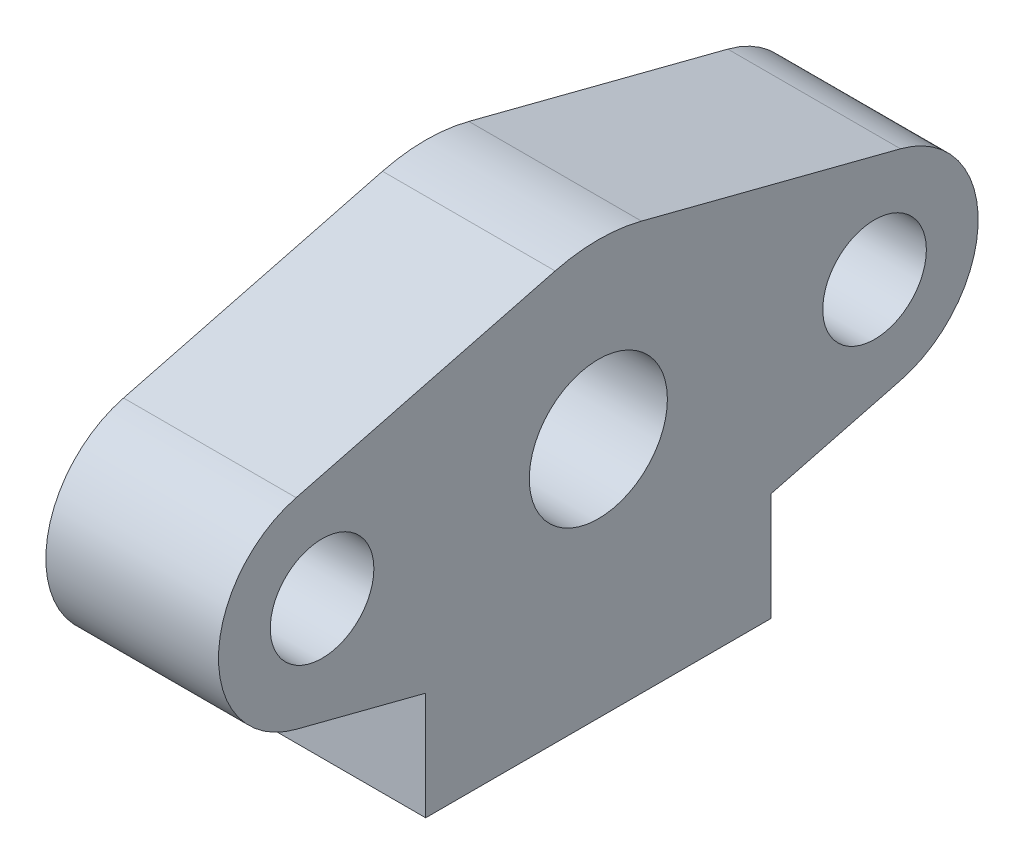
ISO-10303-21;
HEADER;
FILE_DESCRIPTION(('STEP AP214'),'2;1');
FILE_NAME('part.step','',(''),(''),'','','');
FILE_SCHEMA(('AUTOMOTIVE_DESIGN { 1 0 10303 214 1 1 1 1 }'));
ENDSEC;
DATA;
#1=APPLICATION_CONTEXT('core data for automotive mechanical design processes');
#2=APPLICATION_PROTOCOL_DEFINITION('international standard','automotive_design',2000,#1);
#3=PRODUCT_CONTEXT('',#1,'mechanical');
#4=PRODUCT('Part','Part','',(#3));
#5=PRODUCT_RELATED_PRODUCT_CATEGORY('part','',(#4));
#6=PRODUCT_DEFINITION_FORMATION('','',#4);
#7=PRODUCT_DEFINITION_CONTEXT('part definition',#1,'design');
#8=PRODUCT_DEFINITION('design','',#6,#7);
#9=PRODUCT_DEFINITION_SHAPE('','',#8);
#10=(LENGTH_UNIT() NAMED_UNIT(*) SI_UNIT(.MILLI.,.METRE.));
#11=(NAMED_UNIT(*) PLANE_ANGLE_UNIT() SI_UNIT($,.RADIAN.));
#12=(NAMED_UNIT(*) SI_UNIT($,.STERADIAN.) SOLID_ANGLE_UNIT());
#13=UNCERTAINTY_MEASURE_WITH_UNIT(LENGTH_MEASURE(1.E-05),#10,'distance_accuracy_value','');
#14=(GEOMETRIC_REPRESENTATION_CONTEXT(3) GLOBAL_UNCERTAINTY_ASSIGNED_CONTEXT((#13)) GLOBAL_UNIT_ASSIGNED_CONTEXT((#10,
#11,#12)) REPRESENTATION_CONTEXT('',''));
#15=CARTESIAN_POINT('',(0.,0.,0.));
#16=DIRECTION('',(0.,0.,1.));
#17=DIRECTION('',(1.,0.,0.));
#18=AXIS2_PLACEMENT_3D('',#15,#16,#17);
#19=CARTESIAN_POINT('',(10.,0.,0.));
#20=DIRECTION('',(1.,0.,0.));
#21=DIRECTION('',(0.,0.,-1.));
#22=AXIS2_PLACEMENT_3D('',#19,#20,#21);
#23=PLANE('',#22);
#24=CARTESIAN_POINT('',(10.,0.,-16.));
#25=DIRECTION('',(1.,0.,0.));
#26=DIRECTION('',(0.,0.,-1.));
#27=AXIS2_PLACEMENT_3D('',#24,#25,#26);
#28=CIRCLE('',#27,3.);
#29=CARTESIAN_POINT('',(10.,0.,-19.));
#30=VERTEX_POINT('',#29);
#31=EDGE_CURVE('E211',#30,#30,#28,.T.);
#32=ORIENTED_EDGE('',*,*,#31,.F.);
#33=EDGE_LOOP('',(#32));
#34=FACE_BOUND('',#33,.T.);
#35=CARTESIAN_POINT('',(10.,0.,0.));
#36=DIRECTION('',(1.,0.,0.));
#37=DIRECTION('',(0.,0.,-1.));
#38=AXIS2_PLACEMENT_3D('',#35,#36,#37);
#39=CIRCLE('',#38,10.);
#40=CARTESIAN_POINT('',(10.,9.68245836551855,-2.5));
#41=VERTEX_POINT('',#40);
#42=CARTESIAN_POINT('',(10.,9.68245836551855,2.5));
#43=VERTEX_POINT('',#42);
#44=EDGE_CURVE('E160',#41,#43,#39,.T.);
#45=ORIENTED_EDGE('',*,*,#44,.T.);
#46=DIRECTION('',(0.,-0.25,0.968245836551854));
#47=VECTOR('',#46,1.);
#48=CARTESIAN_POINT('',(10.,5.80947501931113,17.5));
#49=LINE('',#48,#47);
#50=CARTESIAN_POINT('',(10.,5.80947501931113,17.5));
#51=VERTEX_POINT('',#50);
#52=EDGE_CURVE('E98',#43,#51,#49,.T.);
#53=ORIENTED_EDGE('',*,*,#52,.T.);
#54=CARTESIAN_POINT('',(10.,0.,16.));
#55=DIRECTION('',(1.,0.,0.));
#56=DIRECTION('',(0.,0.,-1.));
#57=AXIS2_PLACEMENT_3D('',#54,#55,#56);
#58=CIRCLE('',#57,6.);
#59=CARTESIAN_POINT('',(10.,-5.80947501931113,17.5));
#60=VERTEX_POINT('',#59);
#61=EDGE_CURVE('E181',#51,#60,#58,.T.);
#62=ORIENTED_EDGE('',*,*,#61,.T.);
#63=DIRECTION('',(0.,-0.25,-0.968245836551854));
#64=VECTOR('',#63,1.);
#65=CARTESIAN_POINT('',(10.,-5.80947501931113,17.5));
#66=LINE('',#65,#64);
#67=CARTESIAN_POINT('',(10.,-7.74596669241484,10.));
#68=VERTEX_POINT('',#67);
#69=EDGE_CURVE('E200',#60,#68,#66,.T.);
#70=ORIENTED_EDGE('',*,*,#69,.T.);
#71=DIRECTION('',(0.,-1.,0.));
#72=VECTOR('',#71,1.);
#73=CARTESIAN_POINT('',(10.,-7.74596669241484,10.));
#74=LINE('',#73,#72);
#75=CARTESIAN_POINT('',(10.,-14.,10.));
#76=VERTEX_POINT('',#75);
#77=EDGE_CURVE('E197',#68,#76,#74,.T.);
#78=ORIENTED_EDGE('',*,*,#77,.T.);
#79=DIRECTION('',(0.,0.,-1.));
#80=VECTOR('',#79,1.);
#81=CARTESIAN_POINT('',(10.,-14.,10.));
#82=LINE('',#81,#80);
#83=CARTESIAN_POINT('',(10.,-14.,-10.));
#84=VERTEX_POINT('',#83);
#85=EDGE_CURVE('E199',#76,#84,#82,.T.);
#86=ORIENTED_EDGE('',*,*,#85,.T.);
#87=DIRECTION('',(0.,1.,0.));
#88=VECTOR('',#87,1.);
#89=CARTESIAN_POINT('',(10.,-7.74596669241484,-10.));
#90=LINE('',#89,#88);
#91=CARTESIAN_POINT('',(10.,-7.74596669241484,-10.));
#92=VERTEX_POINT('',#91);
#93=EDGE_CURVE('E123',#84,#92,#90,.T.);
#94=ORIENTED_EDGE('',*,*,#93,.T.);
#95=DIRECTION('',(0.,0.25,-0.968245836551854));
#96=VECTOR('',#95,1.);
#97=CARTESIAN_POINT('',(10.,-5.80947501931113,-17.5));
#98=LINE('',#97,#96);
#99=CARTESIAN_POINT('',(10.,-5.80947501931113,-17.5));
#100=VERTEX_POINT('',#99);
#101=EDGE_CURVE('E117',#92,#100,#98,.T.);
#102=ORIENTED_EDGE('',*,*,#101,.T.);
#103=CARTESIAN_POINT('',(10.,0.,-16.));
#104=DIRECTION('',(1.,0.,0.));
#105=DIRECTION('',(0.,0.,1.));
#106=AXIS2_PLACEMENT_3D('',#103,#104,#105);
#107=CIRCLE('',#106,6.);
#108=CARTESIAN_POINT('',(10.,5.80947501931113,-17.5));
#109=VERTEX_POINT('',#108);
#110=EDGE_CURVE('E121',#100,#109,#107,.T.);
#111=ORIENTED_EDGE('',*,*,#110,.T.);
#112=DIRECTION('',(0.,0.25,0.968245836551854));
#113=VECTOR('',#112,1.);
#114=CARTESIAN_POINT('',(10.,5.80947501931113,-17.5));
#115=LINE('',#114,#113);
#116=EDGE_CURVE('E49',#109,#41,#115,.T.);
#117=ORIENTED_EDGE('',*,*,#116,.T.);
#118=EDGE_LOOP('',(#45,#53,#62,#70,#78,#86,#94,#102,#111,#117));
#119=FACE_BOUND('',#118,.T.);
#120=CARTESIAN_POINT('',(10.,0.,0.));
#121=DIRECTION('',(1.,0.,0.));
#122=DIRECTION('',(0.,0.,-1.));
#123=AXIS2_PLACEMENT_3D('',#120,#121,#122);
#124=CIRCLE('',#123,4.);
#125=CARTESIAN_POINT('',(10.,0.,-4.));
#126=VERTEX_POINT('',#125);
#127=EDGE_CURVE('E145',#126,#126,#124,.T.);
#128=ORIENTED_EDGE('',*,*,#127,.F.);
#129=EDGE_LOOP('',(#128));
#130=FACE_BOUND('',#129,.T.);
#131=CARTESIAN_POINT('',(10.,0.,16.));
#132=DIRECTION('',(1.,0.,0.));
#133=DIRECTION('',(0.,0.,-1.));
#134=AXIS2_PLACEMENT_3D('',#131,#132,#133);
#135=CIRCLE('',#134,3.);
#136=CARTESIAN_POINT('',(10.,0.,13.));
#137=VERTEX_POINT('',#136);
#138=EDGE_CURVE('E217',#137,#137,#135,.T.);
#139=ORIENTED_EDGE('',*,*,#138,.F.);
#140=EDGE_LOOP('',(#139));
#141=FACE_BOUND('',#140,.T.);
#142=ADVANCED_FACE('F32',(#34,#119,#130,#141),#23,.T.);
#143=CARTESIAN_POINT('',(0.,0.,0.));
#144=DIRECTION('',(1.,0.,0.));
#145=DIRECTION('',(0.,0.,-1.));
#146=AXIS2_PLACEMENT_3D('',#143,#144,#145);
#147=PLANE('',#146);
#148=CARTESIAN_POINT('',(0.,0.,0.));
#149=DIRECTION('',(1.,0.,0.));
#150=DIRECTION('',(0.,0.,-1.));
#151=AXIS2_PLACEMENT_3D('',#148,#149,#150);
#152=CIRCLE('',#151,10.);
#153=CARTESIAN_POINT('',(0.,9.68245836551855,-2.5));
#154=VERTEX_POINT('',#153);
#155=CARTESIAN_POINT('',(0.,9.68245836551855,2.5));
#156=VERTEX_POINT('',#155);
#157=EDGE_CURVE('E141',#154,#156,#152,.T.);
#158=ORIENTED_EDGE('',*,*,#157,.F.);
#159=DIRECTION('',(0.,0.25,0.968245836551854));
#160=VECTOR('',#159,1.);
#161=CARTESIAN_POINT('',(0.,5.80947501931113,-17.5));
#162=LINE('',#161,#160);
#163=CARTESIAN_POINT('',(0.,5.80947501931113,-17.5));
#164=VERTEX_POINT('',#163);
#165=EDGE_CURVE('E90',#164,#154,#162,.T.);
#166=ORIENTED_EDGE('',*,*,#165,.F.);
#167=CARTESIAN_POINT('',(0.,0.,-16.));
#168=DIRECTION('',(1.,0.,0.));
#169=DIRECTION('',(0.,0.,1.));
#170=AXIS2_PLACEMENT_3D('',#167,#168,#169);
#171=CIRCLE('',#170,6.);
#172=CARTESIAN_POINT('',(0.,-5.80947501931113,-17.5));
#173=VERTEX_POINT('',#172);
#174=EDGE_CURVE('E84',#173,#164,#171,.T.);
#175=ORIENTED_EDGE('',*,*,#174,.F.);
#176=DIRECTION('',(0.,0.25,-0.968245836551854));
#177=VECTOR('',#176,1.);
#178=CARTESIAN_POINT('',(0.,-5.80947501931113,-17.5));
#179=LINE('',#178,#177);
#180=CARTESIAN_POINT('',(0.,-7.74596669241484,-10.));
#181=VERTEX_POINT('',#180);
#182=EDGE_CURVE('E131',#181,#173,#179,.T.);
#183=ORIENTED_EDGE('',*,*,#182,.F.);
#184=DIRECTION('',(0.,1.,0.));
#185=VECTOR('',#184,1.);
#186=CARTESIAN_POINT('',(0.,-7.74596669241484,-10.));
#187=LINE('',#186,#185);
#188=CARTESIAN_POINT('',(0.,-14.,-10.));
#189=VERTEX_POINT('',#188);
#190=EDGE_CURVE('E155',#189,#181,#187,.T.);
#191=ORIENTED_EDGE('',*,*,#190,.F.);
#192=DIRECTION('',(0.,0.,-1.));
#193=VECTOR('',#192,1.);
#194=CARTESIAN_POINT('',(0.,-14.,10.));
#195=LINE('',#194,#193);
#196=CARTESIAN_POINT('',(0.,-14.,10.));
#197=VERTEX_POINT('',#196);
#198=EDGE_CURVE('E153',#197,#189,#195,.T.);
#199=ORIENTED_EDGE('',*,*,#198,.F.);
#200=DIRECTION('',(0.,-1.,0.));
#201=VECTOR('',#200,1.);
#202=CARTESIAN_POINT('',(0.,-7.74596669241484,10.));
#203=LINE('',#202,#201);
#204=CARTESIAN_POINT('',(0.,-7.74596669241484,10.));
#205=VERTEX_POINT('',#204);
#206=EDGE_CURVE('E151',#205,#197,#203,.T.);
#207=ORIENTED_EDGE('',*,*,#206,.F.);
#208=DIRECTION('',(0.,-0.25,-0.968245836551854));
#209=VECTOR('',#208,1.);
#210=CARTESIAN_POINT('',(0.,-5.80947501931113,17.5));
#211=LINE('',#210,#209);
#212=CARTESIAN_POINT('',(0.,-5.80947501931113,17.5));
#213=VERTEX_POINT('',#212);
#214=EDGE_CURVE('E149',#213,#205,#211,.T.);
#215=ORIENTED_EDGE('',*,*,#214,.F.);
#216=CARTESIAN_POINT('',(0.,0.,16.));
#217=DIRECTION('',(1.,0.,0.));
#218=DIRECTION('',(0.,0.,-1.));
#219=AXIS2_PLACEMENT_3D('',#216,#217,#218);
#220=CIRCLE('',#219,6.);
#221=CARTESIAN_POINT('',(0.,5.80947501931113,17.5));
#222=VERTEX_POINT('',#221);
#223=EDGE_CURVE('E147',#222,#213,#220,.T.);
#224=ORIENTED_EDGE('',*,*,#223,.F.);
#225=DIRECTION('',(0.,-0.25,0.968245836551854));
#226=VECTOR('',#225,1.);
#227=CARTESIAN_POINT('',(0.,5.80947501931113,17.5));
#228=LINE('',#227,#226);
#229=EDGE_CURVE('E144',#156,#222,#228,.T.);
#230=ORIENTED_EDGE('',*,*,#229,.F.);
#231=EDGE_LOOP('',(#158,#166,#175,#183,#191,#199,#207,#215,#224,#230));
#232=FACE_BOUND('',#231,.T.);
#233=CARTESIAN_POINT('',(0.,0.,0.));
#234=DIRECTION('',(1.,0.,0.));
#235=DIRECTION('',(0.,0.,-1.));
#236=AXIS2_PLACEMENT_3D('',#233,#234,#235);
#237=CIRCLE('',#236,4.);
#238=CARTESIAN_POINT('',(0.,0.,-4.));
#239=VERTEX_POINT('',#238);
#240=EDGE_CURVE('E208',#239,#239,#237,.T.);
#241=ORIENTED_EDGE('',*,*,#240,.T.);
#242=EDGE_LOOP('',(#241));
#243=FACE_BOUND('',#242,.T.);
#244=CARTESIAN_POINT('',(0.,0.,-16.));
#245=DIRECTION('',(1.,0.,0.));
#246=DIRECTION('',(0.,0.,-1.));
#247=AXIS2_PLACEMENT_3D('',#244,#245,#246);
#248=CIRCLE('',#247,3.);
#249=CARTESIAN_POINT('',(0.,0.,-19.));
#250=VERTEX_POINT('',#249);
#251=EDGE_CURVE('E214',#250,#250,#248,.T.);
#252=ORIENTED_EDGE('',*,*,#251,.T.);
#253=EDGE_LOOP('',(#252));
#254=FACE_BOUND('',#253,.T.);
#255=CARTESIAN_POINT('',(0.,0.,16.));
#256=DIRECTION('',(1.,0.,0.));
#257=DIRECTION('',(0.,0.,-1.));
#258=AXIS2_PLACEMENT_3D('',#255,#256,#257);
#259=CIRCLE('',#258,3.);
#260=CARTESIAN_POINT('',(0.,0.,13.));
#261=VERTEX_POINT('',#260);
#262=EDGE_CURVE('E220',#261,#261,#259,.T.);
#263=ORIENTED_EDGE('',*,*,#262,.T.);
#264=EDGE_LOOP('',(#263));
#265=FACE_BOUND('',#264,.T.);
#266=ADVANCED_FACE('F185',(#232,#243,#254,#265),#147,.F.);
#267=CARTESIAN_POINT('',(10.,0.,0.));
#268=DIRECTION('',(-1.,0.,0.));
#269=DIRECTION('',(0.,0.,1.));
#270=AXIS2_PLACEMENT_3D('',#267,#268,#269);
#271=CYLINDRICAL_SURFACE('',#270,10.);
#272=ORIENTED_EDGE('',*,*,#157,.T.);
#273=DIRECTION('',(-1.,0.,0.));
#274=VECTOR('',#273,1.);
#275=CARTESIAN_POINT('',(10.,9.68245836551855,2.5));
#276=LINE('',#275,#274);
#277=EDGE_CURVE('E11',#43,#156,#276,.T.);
#278=ORIENTED_EDGE('',*,*,#277,.F.);
#279=ORIENTED_EDGE('',*,*,#44,.F.);
#280=DIRECTION('',(-1.,0.,0.));
#281=VECTOR('',#280,1.);
#282=CARTESIAN_POINT('',(10.,9.68245836551855,-2.5));
#283=LINE('',#282,#281);
#284=EDGE_CURVE('E137',#41,#154,#283,.T.);
#285=ORIENTED_EDGE('',*,*,#284,.T.);
#286=EDGE_LOOP('',(#272,#278,#279,#285));
#287=FACE_BOUND('',#286,.T.);
#288=ADVANCED_FACE('F34',(#287),#271,.T.);
#289=CARTESIAN_POINT('',(10.,5.80947501931113,17.5));
#290=DIRECTION('',(0.,-0.968245836551854,-0.25));
#291=DIRECTION('',(0.,0.25,-0.968245836551854));
#292=AXIS2_PLACEMENT_3D('',#289,#290,#291);
#293=PLANE('',#292);
#294=ORIENTED_EDGE('',*,*,#229,.T.);
#295=DIRECTION('',(-1.,0.,0.));
#296=VECTOR('',#295,1.);
#297=CARTESIAN_POINT('',(10.,5.80947501931113,17.5));
#298=LINE('',#297,#296);
#299=EDGE_CURVE('E41',#51,#222,#298,.T.);
#300=ORIENTED_EDGE('',*,*,#299,.F.);
#301=ORIENTED_EDGE('',*,*,#52,.F.);
#302=ORIENTED_EDGE('',*,*,#277,.T.);
#303=EDGE_LOOP('',(#294,#300,#301,#302));
#304=FACE_BOUND('',#303,.T.);
#305=ADVANCED_FACE('F261',(#304),#293,.F.);
#306=CARTESIAN_POINT('',(10.,0.,16.));
#307=DIRECTION('',(-1.,0.,0.));
#308=DIRECTION('',(0.,0.,1.));
#309=AXIS2_PLACEMENT_3D('',#306,#307,#308);
#310=CYLINDRICAL_SURFACE('',#309,6.);
#311=ORIENTED_EDGE('',*,*,#223,.T.);
#312=DIRECTION('',(-1.,0.,0.));
#313=VECTOR('',#312,1.);
#314=CARTESIAN_POINT('',(10.,-5.80947501931113,17.5));
#315=LINE('',#314,#313);
#316=EDGE_CURVE('E173',#60,#213,#315,.T.);
#317=ORIENTED_EDGE('',*,*,#316,.F.);
#318=ORIENTED_EDGE('',*,*,#61,.F.);
#319=ORIENTED_EDGE('',*,*,#299,.T.);
#320=EDGE_LOOP('',(#311,#317,#318,#319));
#321=FACE_BOUND('',#320,.T.);
#322=ADVANCED_FACE('F179',(#321),#310,.T.);
#323=CARTESIAN_POINT('',(10.,-5.80947501931113,17.5));
#324=DIRECTION('',(0.,0.968245836551854,-0.25));
#325=DIRECTION('',(0.,0.25,0.968245836551854));
#326=AXIS2_PLACEMENT_3D('',#323,#324,#325);
#327=PLANE('',#326);
#328=ORIENTED_EDGE('',*,*,#214,.T.);
#329=DIRECTION('',(-1.,0.,0.));
#330=VECTOR('',#329,1.);
#331=CARTESIAN_POINT('',(10.,-7.74596669241484,10.));
#332=LINE('',#331,#330);
#333=EDGE_CURVE('E170',#68,#205,#332,.T.);
#334=ORIENTED_EDGE('',*,*,#333,.F.);
#335=ORIENTED_EDGE('',*,*,#69,.F.);
#336=ORIENTED_EDGE('',*,*,#316,.T.);
#337=EDGE_LOOP('',(#328,#334,#335,#336));
#338=FACE_BOUND('',#337,.T.);
#339=ADVANCED_FACE('F191',(#338),#327,.F.);
#340=CARTESIAN_POINT('',(10.,-7.74596669241484,10.));
#341=DIRECTION('',(0.,0.,-1.));
#342=DIRECTION('',(-1.,0.,0.));
#343=AXIS2_PLACEMENT_3D('',#340,#341,#342);
#344=PLANE('',#343);
#345=ORIENTED_EDGE('',*,*,#206,.T.);
#346=DIRECTION('',(-1.,0.,0.));
#347=VECTOR('',#346,1.);
#348=CARTESIAN_POINT('',(10.,-14.,10.));
#349=LINE('',#348,#347);
#350=EDGE_CURVE('E167',#76,#197,#349,.T.);
#351=ORIENTED_EDGE('',*,*,#350,.F.);
#352=ORIENTED_EDGE('',*,*,#77,.F.);
#353=ORIENTED_EDGE('',*,*,#333,.T.);
#354=EDGE_LOOP('',(#345,#351,#352,#353));
#355=FACE_BOUND('',#354,.T.);
#356=ADVANCED_FACE('F195',(#355),#344,.F.);
#357=CARTESIAN_POINT('',(10.,-14.,10.));
#358=DIRECTION('',(0.,1.,0.));
#359=DIRECTION('',(0.,0.,1.));
#360=AXIS2_PLACEMENT_3D('',#357,#358,#359);
#361=PLANE('',#360);
#362=ORIENTED_EDGE('',*,*,#198,.T.);
#363=DIRECTION('',(-1.,0.,0.));
#364=VECTOR('',#363,1.);
#365=CARTESIAN_POINT('',(10.,-14.,-10.));
#366=LINE('',#365,#364);
#367=EDGE_CURVE('E164',#84,#189,#366,.T.);
#368=ORIENTED_EDGE('',*,*,#367,.F.);
#369=ORIENTED_EDGE('',*,*,#85,.F.);
#370=ORIENTED_EDGE('',*,*,#350,.T.);
#371=EDGE_LOOP('',(#362,#368,#369,#370));
#372=FACE_BOUND('',#371,.T.);
#373=ADVANCED_FACE('F251',(#372),#361,.F.);
#374=CARTESIAN_POINT('',(10.,-7.74596669241484,-10.));
#375=DIRECTION('',(0.,0.,1.));
#376=DIRECTION('',(1.,0.,0.));
#377=AXIS2_PLACEMENT_3D('',#374,#375,#376);
#378=PLANE('',#377);
#379=ORIENTED_EDGE('',*,*,#190,.T.);
#380=DIRECTION('',(-1.,0.,0.));
#381=VECTOR('',#380,1.);
#382=CARTESIAN_POINT('',(10.,-7.74596669241484,-10.));
#383=LINE('',#382,#381);
#384=EDGE_CURVE('E132',#92,#181,#383,.T.);
#385=ORIENTED_EDGE('',*,*,#384,.F.);
#386=ORIENTED_EDGE('',*,*,#93,.F.);
#387=ORIENTED_EDGE('',*,*,#367,.T.);
#388=EDGE_LOOP('',(#379,#385,#386,#387));
#389=FACE_BOUND('',#388,.T.);
#390=ADVANCED_FACE('F248',(#389),#378,.F.);
#391=CARTESIAN_POINT('',(10.,-5.80947501931113,-17.5));
#392=DIRECTION('',(0.,0.968245836551854,0.25));
#393=DIRECTION('',(0.,-0.25,0.968245836551854));
#394=AXIS2_PLACEMENT_3D('',#391,#392,#393);
#395=PLANE('',#394);
#396=ORIENTED_EDGE('',*,*,#182,.T.);
#397=DIRECTION('',(-1.,0.,0.));
#398=VECTOR('',#397,1.);
#399=CARTESIAN_POINT('',(10.,-5.80947501931113,-17.5));
#400=LINE('',#399,#398);
#401=EDGE_CURVE('E128',#100,#173,#400,.T.);
#402=ORIENTED_EDGE('',*,*,#401,.F.);
#403=ORIENTED_EDGE('',*,*,#101,.F.);
#404=ORIENTED_EDGE('',*,*,#384,.T.);
#405=EDGE_LOOP('',(#396,#402,#403,#404));
#406=FACE_BOUND('',#405,.T.);
#407=ADVANCED_FACE('F129',(#406),#395,.F.);
#408=CARTESIAN_POINT('',(10.,0.,-16.));
#409=DIRECTION('',(-1.,0.,0.));
#410=DIRECTION('',(0.,0.,1.));
#411=AXIS2_PLACEMENT_3D('',#408,#409,#410);
#412=CYLINDRICAL_SURFACE('',#411,6.);
#413=ORIENTED_EDGE('',*,*,#174,.T.);
#414=DIRECTION('',(-1.,0.,0.));
#415=VECTOR('',#414,1.);
#416=CARTESIAN_POINT('',(10.,5.80947501931113,-17.5));
#417=LINE('',#416,#415);
#418=EDGE_CURVE('E133',#109,#164,#417,.T.);
#419=ORIENTED_EDGE('',*,*,#418,.F.);
#420=ORIENTED_EDGE('',*,*,#110,.F.);
#421=ORIENTED_EDGE('',*,*,#401,.T.);
#422=EDGE_LOOP('',(#413,#419,#420,#421));
#423=FACE_BOUND('',#422,.T.);
#424=ADVANCED_FACE('F135',(#423),#412,.T.);
#425=CARTESIAN_POINT('',(10.,5.80947501931113,-17.5));
#426=DIRECTION('',(0.,-0.968245836551854,0.25));
#427=DIRECTION('',(0.,-0.25,-0.968245836551854));
#428=AXIS2_PLACEMENT_3D('',#425,#426,#427);
#429=PLANE('',#428);
#430=ORIENTED_EDGE('',*,*,#165,.T.);
#431=ORIENTED_EDGE('',*,*,#284,.F.);
#432=ORIENTED_EDGE('',*,*,#116,.F.);
#433=ORIENTED_EDGE('',*,*,#418,.T.);
#434=EDGE_LOOP('',(#430,#431,#432,#433));
#435=FACE_BOUND('',#434,.T.);
#436=ADVANCED_FACE('F241',(#435),#429,.F.);
#437=CARTESIAN_POINT('',(10.,0.,0.));
#438=DIRECTION('',(-1.,0.,0.));
#439=DIRECTION('',(0.,0.,1.));
#440=AXIS2_PLACEMENT_3D('',#437,#438,#439);
#441=CYLINDRICAL_SURFACE('',#440,4.);
#442=ORIENTED_EDGE('',*,*,#127,.T.);
#443=EDGE_LOOP('',(#442));
#444=FACE_BOUND('',#443,.T.);
#445=ORIENTED_EDGE('',*,*,#240,.F.);
#446=EDGE_LOOP('',(#445));
#447=FACE_BOUND('',#446,.T.);
#448=ADVANCED_FACE('F238',(#444,#447),#441,.F.);
#449=CARTESIAN_POINT('',(10.,0.,-16.));
#450=DIRECTION('',(-1.,0.,0.));
#451=DIRECTION('',(0.,0.,1.));
#452=AXIS2_PLACEMENT_3D('',#449,#450,#451);
#453=CYLINDRICAL_SURFACE('',#452,3.);
#454=ORIENTED_EDGE('',*,*,#31,.T.);
#455=EDGE_LOOP('',(#454));
#456=FACE_BOUND('',#455,.T.);
#457=ORIENTED_EDGE('',*,*,#251,.F.);
#458=EDGE_LOOP('',(#457));
#459=FACE_BOUND('',#458,.T.);
#460=ADVANCED_FACE('F337',(#456,#459),#453,.F.);
#461=CARTESIAN_POINT('',(10.,0.,16.));
#462=DIRECTION('',(-1.,0.,0.));
#463=DIRECTION('',(0.,0.,1.));
#464=AXIS2_PLACEMENT_3D('',#461,#462,#463);
#465=CYLINDRICAL_SURFACE('',#464,3.);
#466=ORIENTED_EDGE('',*,*,#138,.T.);
#467=EDGE_LOOP('',(#466));
#468=FACE_BOUND('',#467,.T.);
#469=ORIENTED_EDGE('',*,*,#262,.F.);
#470=EDGE_LOOP('',(#469));
#471=FACE_BOUND('',#470,.T.);
#472=ADVANCED_FACE('F226',(#468,#471),#465,.F.);
#473=CLOSED_SHELL('',(#142,#266,#288,#305,#322,#339,#356,#373,#390,#407,#424,#436,#448,#460,#472));
#474=MANIFOLD_SOLID_BREP('B2',#473);
#475=ADVANCED_BREP_SHAPE_REPRESENTATION('',(#18,#474),#14);
#476=SHAPE_DEFINITION_REPRESENTATION(#9,#475);
ENDSEC;
END-ISO-10303-21;
